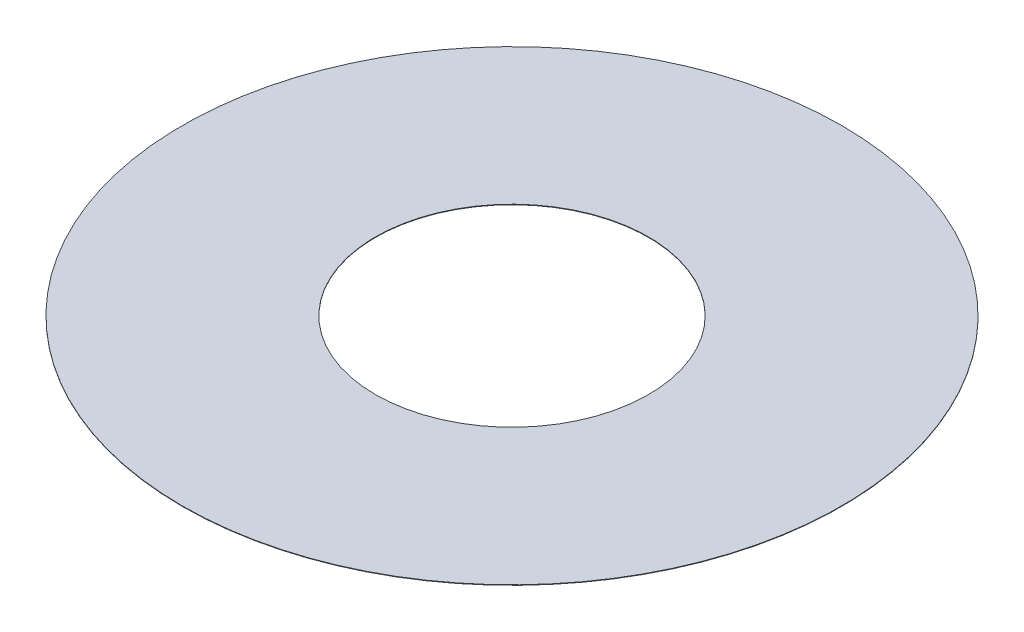
ISO-10303-21;
HEADER;
FILE_DESCRIPTION(('STEP AP214'),'2;1');
FILE_NAME('part.step','',(''),(''),'','','');
FILE_SCHEMA(('AUTOMOTIVE_DESIGN { 1 0 10303 214 1 1 1 1 }'));
ENDSEC;
DATA;
#1=APPLICATION_CONTEXT('core data for automotive mechanical design processes');
#2=APPLICATION_PROTOCOL_DEFINITION('international standard','automotive_design',2000,#1);
#3=PRODUCT_CONTEXT('',#1,'mechanical');
#4=PRODUCT('Part','Part','',(#3));
#5=PRODUCT_RELATED_PRODUCT_CATEGORY('part','',(#4));
#6=PRODUCT_DEFINITION_FORMATION('','',#4);
#7=PRODUCT_DEFINITION_CONTEXT('part definition',#1,'design');
#8=PRODUCT_DEFINITION('design','',#6,#7);
#9=PRODUCT_DEFINITION_SHAPE('','',#8);
#10=(LENGTH_UNIT() NAMED_UNIT(*) SI_UNIT(.MILLI.,.METRE.));
#11=(NAMED_UNIT(*) PLANE_ANGLE_UNIT() SI_UNIT($,.RADIAN.));
#12=(NAMED_UNIT(*) SI_UNIT($,.STERADIAN.) SOLID_ANGLE_UNIT());
#13=UNCERTAINTY_MEASURE_WITH_UNIT(LENGTH_MEASURE(1.E-05),#10,'distance_accuracy_value','');
#14=(GEOMETRIC_REPRESENTATION_CONTEXT(3) GLOBAL_UNCERTAINTY_ASSIGNED_CONTEXT((#13)) GLOBAL_UNIT_ASSIGNED_CONTEXT((#10,
#11,#12)) REPRESENTATION_CONTEXT('',''));
#15=CARTESIAN_POINT('',(0.,0.,0.));
#16=DIRECTION('',(0.,0.,1.));
#17=DIRECTION('',(1.,0.,0.));
#18=AXIS2_PLACEMENT_3D('',#15,#16,#17);
#19=CARTESIAN_POINT('',(0.,0.225,0.));
#20=DIRECTION('',(0.,-1.,0.));
#21=DIRECTION('',(0.,0.,-1.));
#22=AXIS2_PLACEMENT_3D('',#19,#20,#21);
#23=CYLINDRICAL_SURFACE('',#22,152.);
#24=CARTESIAN_POINT('',(0.,0.225,0.));
#25=DIRECTION('',(0.,1.,0.));
#26=DIRECTION('',(0.,0.,1.));
#27=AXIS2_PLACEMENT_3D('',#24,#25,#26);
#28=CIRCLE('',#27,152.);
#29=CARTESIAN_POINT('',(0.,0.225,152.));
#30=VERTEX_POINT('',#29);
#31=EDGE_CURVE('E10',#30,#30,#28,.T.);
#32=ORIENTED_EDGE('',*,*,#31,.F.);
#33=EDGE_LOOP('',(#32));
#34=FACE_BOUND('',#33,.T.);
#35=CARTESIAN_POINT('',(0.,0.,0.));
#36=DIRECTION('',(0.,1.,0.));
#37=DIRECTION('',(0.,0.,1.));
#38=AXIS2_PLACEMENT_3D('',#35,#36,#37);
#39=CIRCLE('',#38,152.);
#40=CARTESIAN_POINT('',(0.,0.,152.));
#41=VERTEX_POINT('',#40);
#42=EDGE_CURVE('E34',#41,#41,#39,.T.);
#43=ORIENTED_EDGE('',*,*,#42,.T.);
#44=EDGE_LOOP('',(#43));
#45=FACE_BOUND('',#44,.T.);
#46=ADVANCED_FACE('F31',(#34,#45),#23,.T.);
#47=CARTESIAN_POINT('',(0.,0.225,0.));
#48=DIRECTION('',(0.,1.,0.));
#49=DIRECTION('',(0.,0.,1.));
#50=AXIS2_PLACEMENT_3D('',#47,#48,#49);
#51=PLANE('',#50);
#52=CARTESIAN_POINT('',(0.,0.225,0.));
#53=DIRECTION('',(0.,1.,0.));
#54=DIRECTION('',(0.,0.,1.));
#55=AXIS2_PLACEMENT_3D('',#52,#53,#54);
#56=CIRCLE('',#55,63.);
#57=CARTESIAN_POINT('',(0.,0.225,63.));
#58=VERTEX_POINT('',#57);
#59=EDGE_CURVE('E43',#58,#58,#56,.T.);
#60=ORIENTED_EDGE('',*,*,#59,.F.);
#61=EDGE_LOOP('',(#60));
#62=FACE_BOUND('',#61,.T.);
#63=ORIENTED_EDGE('',*,*,#31,.T.);
#64=EDGE_LOOP('',(#63));
#65=FACE_BOUND('',#64,.T.);
#66=ADVANCED_FACE('F58',(#62,#65),#51,.T.);
#67=CARTESIAN_POINT('',(0.,0.,0.));
#68=DIRECTION('',(0.,1.,0.));
#69=DIRECTION('',(0.,0.,1.));
#70=AXIS2_PLACEMENT_3D('',#67,#68,#69);
#71=PLANE('',#70);
#72=CARTESIAN_POINT('',(0.,0.,0.));
#73=DIRECTION('',(0.,1.,0.));
#74=DIRECTION('',(0.,0.,1.));
#75=AXIS2_PLACEMENT_3D('',#72,#73,#74);
#76=CIRCLE('',#75,63.);
#77=CARTESIAN_POINT('',(0.,0.,63.));
#78=VERTEX_POINT('',#77);
#79=EDGE_CURVE('E41',#78,#78,#76,.T.);
#80=ORIENTED_EDGE('',*,*,#79,.T.);
#81=EDGE_LOOP('',(#80));
#82=FACE_BOUND('',#81,.T.);
#83=ORIENTED_EDGE('',*,*,#42,.F.);
#84=EDGE_LOOP('',(#83));
#85=FACE_BOUND('',#84,.T.);
#86=ADVANCED_FACE('F49',(#82,#85),#71,.F.);
#87=CARTESIAN_POINT('',(0.,0.,0.));
#88=DIRECTION('',(0.,1.,0.));
#89=DIRECTION('',(0.,0.,1.));
#90=AXIS2_PLACEMENT_3D('',#87,#88,#89);
#91=CYLINDRICAL_SURFACE('',#90,63.);
#92=ORIENTED_EDGE('',*,*,#79,.F.);
#93=EDGE_LOOP('',(#92));
#94=FACE_BOUND('',#93,.T.);
#95=ORIENTED_EDGE('',*,*,#59,.T.);
#96=EDGE_LOOP('',(#95));
#97=FACE_BOUND('',#96,.T.);
#98=ADVANCED_FACE('F52',(#94,#97),#91,.F.);
#99=CLOSED_SHELL('',(#46,#66,#86,#98));
#100=MANIFOLD_SOLID_BREP('B2',#99);
#101=ADVANCED_BREP_SHAPE_REPRESENTATION('',(#18,#100),#14);
#102=SHAPE_DEFINITION_REPRESENTATION(#9,#101);
ENDSEC;
END-ISO-10303-21;
